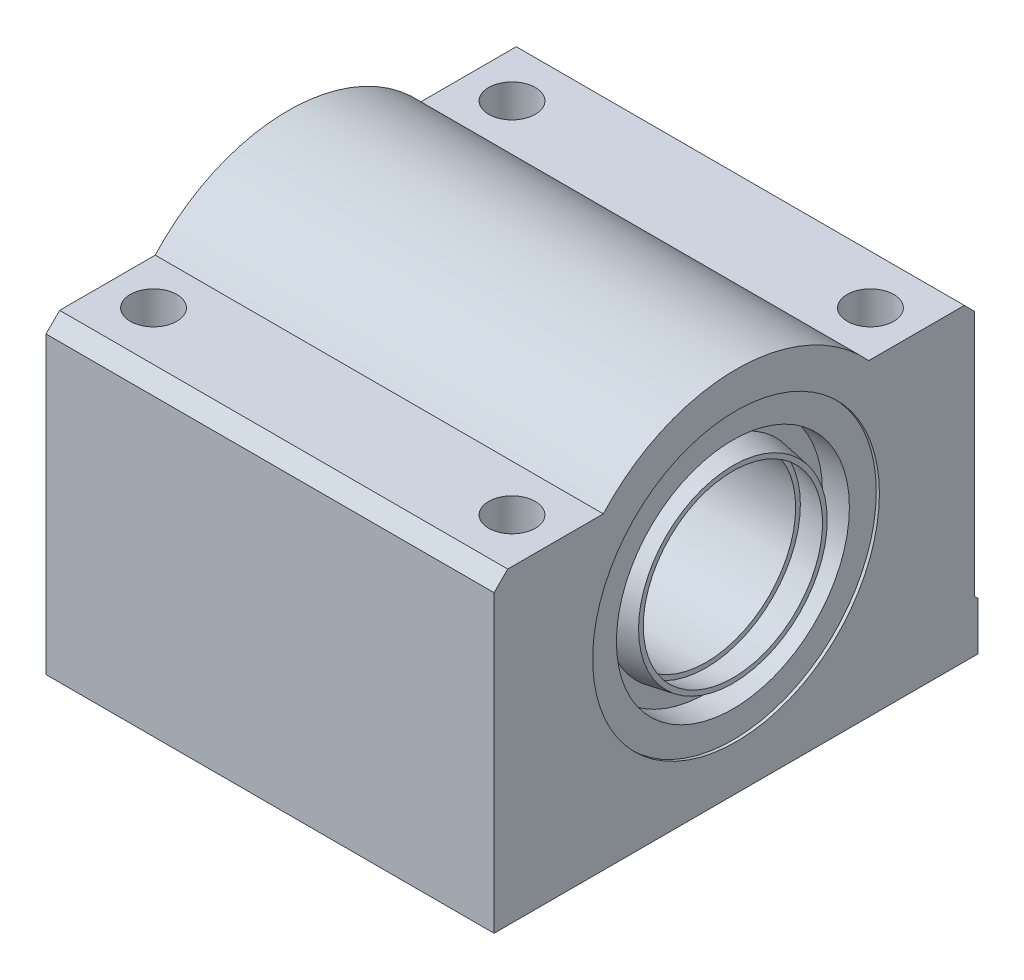
ISO-10303-21;
HEADER;
FILE_DESCRIPTION(('STEP AP214'),'2;1');
FILE_NAME('part.step','',(''),(''),'','','');
FILE_SCHEMA(('AUTOMOTIVE_DESIGN { 1 0 10303 214 1 1 1 1 }'));
ENDSEC;
DATA;
#1=APPLICATION_CONTEXT('core data for automotive mechanical design processes');
#2=APPLICATION_PROTOCOL_DEFINITION('international standard','automotive_design',2000,#1);
#3=PRODUCT_CONTEXT('',#1,'mechanical');
#4=PRODUCT('Part','Part','',(#3));
#5=PRODUCT_RELATED_PRODUCT_CATEGORY('part','',(#4));
#6=PRODUCT_DEFINITION_FORMATION('','',#4);
#7=PRODUCT_DEFINITION_CONTEXT('part definition',#1,'design');
#8=PRODUCT_DEFINITION('design','',#6,#7);
#9=PRODUCT_DEFINITION_SHAPE('','',#8);
#10=(LENGTH_UNIT() NAMED_UNIT(*) SI_UNIT(.MILLI.,.METRE.));
#11=(NAMED_UNIT(*) PLANE_ANGLE_UNIT() SI_UNIT($,.RADIAN.));
#12=(NAMED_UNIT(*) SI_UNIT($,.STERADIAN.) SOLID_ANGLE_UNIT());
#13=UNCERTAINTY_MEASURE_WITH_UNIT(LENGTH_MEASURE(1.E-05),#10,'distance_accuracy_value','');
#14=(GEOMETRIC_REPRESENTATION_CONTEXT(3) GLOBAL_UNCERTAINTY_ASSIGNED_CONTEXT((#13)) GLOBAL_UNIT_ASSIGNED_CONTEXT((#10,
#11,#12)) REPRESENTATION_CONTEXT('',''));
#15=CARTESIAN_POINT('',(0.,0.,0.));
#16=DIRECTION('',(0.,0.,1.));
#17=DIRECTION('',(1.,0.,0.));
#18=AXIS2_PLACEMENT_3D('',#15,#16,#17);
#19=CARTESIAN_POINT('',(-21.65,21.,0.));
#20=DIRECTION('',(-1.,0.,0.));
#21=DIRECTION('',(0.,0.,-1.));
#22=AXIS2_PLACEMENT_3D('',#19,#20,#21);
#23=PLANE('',#22);
#24=CARTESIAN_POINT('',(-21.65,21.,0.));
#25=DIRECTION('',(-1.,0.,0.));
#26=DIRECTION('',(0.,0.,1.));
#27=AXIS2_PLACEMENT_3D('',#24,#25,#26);
#28=CIRCLE('',#27,10.5289809421254);
#29=CARTESIAN_POINT('',(-21.65,21.,10.5289809421254));
#30=VERTEX_POINT('',#29);
#31=EDGE_CURVE('E139',#30,#30,#28,.T.);
#32=ORIENTED_EDGE('',*,*,#31,.T.);
#33=EDGE_LOOP('',(#32));
#34=FACE_BOUND('',#33,.T.);
#35=CARTESIAN_POINT('',(-21.65,21.,0.));
#36=DIRECTION('',(-1.,0.,0.));
#37=DIRECTION('',(0.,0.,1.));
#38=AXIS2_PLACEMENT_3D('',#35,#36,#37);
#39=CIRCLE('',#38,10.);
#40=CARTESIAN_POINT('',(-21.65,21.,10.));
#41=VERTEX_POINT('',#40);
#42=EDGE_CURVE('E161',#41,#41,#39,.T.);
#43=ORIENTED_EDGE('',*,*,#42,.F.);
#44=EDGE_LOOP('',(#43));
#45=FACE_BOUND('',#44,.T.);
#46=ADVANCED_FACE('F32',(#34,#45),#23,.T.);
#47=CARTESIAN_POINT('',(-21.65,21.,0.));
#48=DIRECTION('',(-1.,0.,0.));
#49=DIRECTION('',(0.,0.,1.));
#50=AXIS2_PLACEMENT_3D('',#47,#48,#49);
#51=CIRCLE('',#50,11.0579618842508);
#52=CARTESIAN_POINT('',(-21.65,21.,11.0579618842508));
#53=VERTEX_POINT('',#52);
#54=EDGE_CURVE('E143',#53,#53,#51,.T.);
#55=ORIENTED_EDGE('',*,*,#54,.F.);
#56=EDGE_LOOP('',(#55));
#57=FACE_BOUND('',#56,.T.);
#58=CARTESIAN_POINT('',(-21.65,21.,0.));
#59=DIRECTION('',(1.,0.,0.));
#60=DIRECTION('',(0.,0.,-1.));
#61=AXIS2_PLACEMENT_3D('',#58,#59,#60);
#62=CIRCLE('',#61,13.);
#63=CARTESIAN_POINT('',(-21.65,21.,-13.));
#64=VERTEX_POINT('',#63);
#65=EDGE_CURVE('E152',#64,#64,#62,.T.);
#66=ORIENTED_EDGE('',*,*,#65,.F.);
#67=EDGE_LOOP('',(#66));
#68=FACE_BOUND('',#67,.T.);
#69=ADVANCED_FACE('F270',(#57,#68),#23,.T.);
#70=CARTESIAN_POINT('',(25.,21.,0.));
#71=DIRECTION('',(-1.,0.,0.));
#72=DIRECTION('',(0.,0.,1.));
#73=AXIS2_PLACEMENT_3D('',#70,#71,#72);
#74=CYLINDRICAL_SURFACE('',#73,10.);
#75=CARTESIAN_POINT('',(21.65,21.,0.));
#76=DIRECTION('',(1.,0.,0.));
#77=DIRECTION('',(0.,0.,-1.));
#78=AXIS2_PLACEMENT_3D('',#75,#76,#77);
#79=CIRCLE('',#78,10.);
#80=CARTESIAN_POINT('',(21.65,21.,-10.));
#81=VERTEX_POINT('',#80);
#82=EDGE_CURVE('E183',#81,#81,#79,.T.);
#83=ORIENTED_EDGE('',*,*,#82,.T.);
#84=EDGE_LOOP('',(#83));
#85=FACE_BOUND('',#84,.T.);
#86=ORIENTED_EDGE('',*,*,#42,.T.);
#87=EDGE_LOOP('',(#86));
#88=FACE_BOUND('',#87,.T.);
#89=ADVANCED_FACE('F276',(#85,#88),#74,.F.);
#90=CARTESIAN_POINT('',(21.65,21.,0.));
#91=DIRECTION('',(1.,0.,0.));
#92=DIRECTION('',(0.,0.,-1.));
#93=AXIS2_PLACEMENT_3D('',#90,#91,#92);
#94=PLANE('',#93);
#95=CARTESIAN_POINT('',(21.65,21.,0.));
#96=DIRECTION('',(-1.,0.,0.));
#97=DIRECTION('',(0.,0.,1.));
#98=AXIS2_PLACEMENT_3D('',#95,#96,#97);
#99=CIRCLE('',#98,10.5289809421254);
#100=CARTESIAN_POINT('',(21.65,21.,10.5289809421254));
#101=VERTEX_POINT('',#100);
#102=EDGE_CURVE('E162',#101,#101,#99,.T.);
#103=ORIENTED_EDGE('',*,*,#102,.F.);
#104=EDGE_LOOP('',(#103));
#105=FACE_BOUND('',#104,.T.);
#106=ORIENTED_EDGE('',*,*,#82,.F.);
#107=EDGE_LOOP('',(#106));
#108=FACE_BOUND('',#107,.T.);
#109=ADVANCED_FACE('F311',(#105,#108),#94,.T.);
#110=CARTESIAN_POINT('',(21.65,21.,0.));
#111=DIRECTION('',(-1.,0.,0.));
#112=DIRECTION('',(0.,0.,1.));
#113=AXIS2_PLACEMENT_3D('',#110,#111,#112);
#114=CIRCLE('',#113,11.0579618842508);
#115=CARTESIAN_POINT('',(21.65,21.,11.0579618842508));
#116=VERTEX_POINT('',#115);
#117=EDGE_CURVE('E165',#116,#116,#114,.T.);
#118=ORIENTED_EDGE('',*,*,#117,.T.);
#119=EDGE_LOOP('',(#118));
#120=FACE_BOUND('',#119,.T.);
#121=CARTESIAN_POINT('',(21.65,21.,0.));
#122=DIRECTION('',(1.,0.,0.));
#123=DIRECTION('',(0.,0.,-1.));
#124=AXIS2_PLACEMENT_3D('',#121,#122,#123);
#125=CIRCLE('',#124,13.);
#126=CARTESIAN_POINT('',(21.65,21.,-13.));
#127=VERTEX_POINT('',#126);
#128=EDGE_CURVE('E223',#127,#127,#125,.F.);
#129=ORIENTED_EDGE('',*,*,#128,.F.);
#130=EDGE_LOOP('',(#129));
#131=FACE_BOUND('',#130,.T.);
#132=ADVANCED_FACE('F308',(#120,#131),#94,.T.);
#133=CARTESIAN_POINT('',(25.,21.,0.));
#134=DIRECTION('',(-1.,0.,0.));
#135=DIRECTION('',(0.,0.,1.));
#136=AXIS2_PLACEMENT_3D('',#133,#134,#135);
#137=PLANE('',#136);
#138=CARTESIAN_POINT('',(25.,21.,0.));
#139=DIRECTION('',(1.,0.,0.));
#140=DIRECTION('',(0.,0.,-1.));
#141=AXIS2_PLACEMENT_3D('',#138,#139,#140);
#142=CIRCLE('',#141,16.);
#143=CARTESIAN_POINT('',(25.,21.,-16.));
#144=VERTEX_POINT('',#143);
#145=EDGE_CURVE('E180',#144,#144,#142,.T.);
#146=ORIENTED_EDGE('',*,*,#145,.F.);
#147=EDGE_LOOP('',(#146));
#148=FACE_BOUND('',#147,.T.);
#149=DIRECTION('',(0.,-0.707106781186551,-0.707106781186544));
#150=VECTOR('',#149,1.);
#151=CARTESIAN_POINT('',(25.,5.75,-26.6190944663167));
#152=LINE('',#151,#150);
#153=CARTESIAN_POINT('',(25.,5.75,-26.6190944663167));
#154=VERTEX_POINT('',#153);
#155=CARTESIAN_POINT('',(25.,5.36909446631671,-27.));
#156=VERTEX_POINT('',#155);
#157=EDGE_CURVE('E129',#154,#156,#152,.T.);
#158=ORIENTED_EDGE('',*,*,#157,.F.);
#159=DIRECTION('',(0.,-1.,0.));
#160=VECTOR('',#159,1.);
#161=CARTESIAN_POINT('',(25.,5.75,-26.6190944663167));
#162=LINE('',#161,#160);
#163=CARTESIAN_POINT('',(25.,33.2972833989501,-26.6190944663167));
#164=VERTEX_POINT('',#163);
#165=EDGE_CURVE('E111',#164,#154,#162,.T.);
#166=ORIENTED_EDGE('',*,*,#165,.F.);
#167=DIRECTION('',(0.,-0.707106781186551,-0.707106781186544));
#168=VECTOR('',#167,1.);
#169=CARTESIAN_POINT('',(25.,34.44,-25.4763778652668));
#170=LINE('',#169,#168);
#171=CARTESIAN_POINT('',(25.,34.44,-25.4763778652668));
#172=VERTEX_POINT('',#171);
#173=EDGE_CURVE('E240',#164,#172,#170,.F.);
#174=ORIENTED_EDGE('',*,*,#173,.T.);
#175=DIRECTION('',(0.,0.,1.));
#176=VECTOR('',#175,1.);
#177=CARTESIAN_POINT('',(25.,34.44,-14.8110229221347));
#178=LINE('',#177,#176);
#179=CARTESIAN_POINT('',(25.,34.44,-14.8110229221347));
#180=VERTEX_POINT('',#179);
#181=EDGE_CURVE('E205',#172,#180,#178,.T.);
#182=ORIENTED_EDGE('',*,*,#181,.T.);
#183=CARTESIAN_POINT('',(25.,21.,0.));
#184=DIRECTION('',(1.,0.,0.));
#185=DIRECTION('',(0.,0.,1.));
#186=AXIS2_PLACEMENT_3D('',#183,#184,#185);
#187=CIRCLE('',#186,20.);
#188=CARTESIAN_POINT('',(25.,34.44,14.8110229221347));
#189=VERTEX_POINT('',#188);
#190=EDGE_CURVE('E207',#180,#189,#187,.T.);
#191=ORIENTED_EDGE('',*,*,#190,.T.);
#192=DIRECTION('',(0.,0.,1.));
#193=VECTOR('',#192,1.);
#194=CARTESIAN_POINT('',(25.,34.44,27.));
#195=LINE('',#194,#193);
#196=CARTESIAN_POINT('',(25.,34.44,25.4763778652668));
#197=VERTEX_POINT('',#196);
#198=EDGE_CURVE('E209',#189,#197,#195,.T.);
#199=ORIENTED_EDGE('',*,*,#198,.T.);
#200=DIRECTION('',(0.,0.707106781186546,-0.707106781186549));
#201=VECTOR('',#200,1.);
#202=CARTESIAN_POINT('',(25.,32.9163778652668,27.));
#203=LINE('',#202,#201);
#204=CARTESIAN_POINT('',(25.,32.9163778652668,27.));
#205=VERTEX_POINT('',#204);
#206=EDGE_CURVE('E55',#197,#205,#203,.F.);
#207=ORIENTED_EDGE('',*,*,#206,.T.);
#208=DIRECTION('',(0.,-1.,0.));
#209=VECTOR('',#208,1.);
#210=CARTESIAN_POINT('',(25.,34.44,27.));
#211=LINE('',#210,#209);
#212=CARTESIAN_POINT('',(25.,0.,27.));
#213=VERTEX_POINT('',#212);
#214=EDGE_CURVE('E211',#205,#213,#211,.T.);
#215=ORIENTED_EDGE('',*,*,#214,.T.);
#216=DIRECTION('',(0.,0.,-1.));
#217=VECTOR('',#216,1.);
#218=CARTESIAN_POINT('',(25.,0.,27.));
#219=LINE('',#218,#217);
#220=CARTESIAN_POINT('',(25.,0.,-27.));
#221=VERTEX_POINT('',#220);
#222=EDGE_CURVE('E199',#213,#221,#219,.T.);
#223=ORIENTED_EDGE('',*,*,#222,.T.);
#224=DIRECTION('',(0.,1.,0.));
#225=VECTOR('',#224,1.);
#226=CARTESIAN_POINT('',(25.,0.,-27.));
#227=LINE('',#226,#225);
#228=EDGE_CURVE('E202',#221,#156,#227,.T.);
#229=ORIENTED_EDGE('',*,*,#228,.T.);
#230=EDGE_LOOP('',(#158,#166,#174,#182,#191,#199,#207,#215,#223,#229));
#231=FACE_BOUND('',#230,.T.);
#232=ADVANCED_FACE('F254',(#148,#231),#137,.F.);
#233=CARTESIAN_POINT('',(25.,0.,27.));
#234=DIRECTION('',(0.,1.,0.));
#235=DIRECTION('',(0.,0.,1.));
#236=AXIS2_PLACEMENT_3D('',#233,#234,#235);
#237=PLANE('',#236);
#238=CARTESIAN_POINT('',(-20.,0.,-20.));
#239=DIRECTION('',(0.,-1.,0.));
#240=DIRECTION('',(0.,0.,-1.));
#241=AXIS2_PLACEMENT_3D('',#238,#239,#240);
#242=CIRCLE('',#241,2.6);
#243=CARTESIAN_POINT('',(-20.,0.,-22.6));
#244=VERTEX_POINT('',#243);
#245=EDGE_CURVE('E609',#244,#244,#242,.T.);
#246=ORIENTED_EDGE('',*,*,#245,.F.);
#247=EDGE_LOOP('',(#246));
#248=FACE_BOUND('',#247,.T.);
#249=CARTESIAN_POINT('',(20.,0.,-20.));
#250=DIRECTION('',(0.,-1.,0.));
#251=DIRECTION('',(0.,0.,-1.));
#252=AXIS2_PLACEMENT_3D('',#249,#250,#251);
#253=CIRCLE('',#252,2.6);
#254=CARTESIAN_POINT('',(20.,0.,-22.6));
#255=VERTEX_POINT('',#254);
#256=EDGE_CURVE('E627',#255,#255,#253,.T.);
#257=ORIENTED_EDGE('',*,*,#256,.F.);
#258=EDGE_LOOP('',(#257));
#259=FACE_BOUND('',#258,.T.);
#260=CARTESIAN_POINT('',(20.,0.,20.));
#261=DIRECTION('',(0.,-1.,0.));
#262=DIRECTION('',(0.,0.,-1.));
#263=AXIS2_PLACEMENT_3D('',#260,#261,#262);
#264=CIRCLE('',#263,2.6);
#265=CARTESIAN_POINT('',(20.,0.,17.4));
#266=VERTEX_POINT('',#265);
#267=EDGE_CURVE('E624',#266,#266,#264,.T.);
#268=ORIENTED_EDGE('',*,*,#267,.F.);
#269=EDGE_LOOP('',(#268));
#270=FACE_BOUND('',#269,.T.);
#271=CARTESIAN_POINT('',(-20.,0.,20.));
#272=DIRECTION('',(0.,-1.,0.));
#273=DIRECTION('',(0.,0.,-1.));
#274=AXIS2_PLACEMENT_3D('',#271,#272,#273);
#275=CIRCLE('',#274,2.6);
#276=CARTESIAN_POINT('',(-20.,0.,17.4));
#277=VERTEX_POINT('',#276);
#278=EDGE_CURVE('E133',#277,#277,#275,.T.);
#279=ORIENTED_EDGE('',*,*,#278,.F.);
#280=EDGE_LOOP('',(#279));
#281=FACE_BOUND('',#280,.T.);
#282=DIRECTION('',(-1.,0.,0.));
#283=VECTOR('',#282,1.);
#284=CARTESIAN_POINT('',(25.,0.,27.));
#285=LINE('',#284,#283);
#286=CARTESIAN_POINT('',(-25.,0.,27.));
#287=VERTEX_POINT('',#286);
#288=EDGE_CURVE('E213',#213,#287,#285,.T.);
#289=ORIENTED_EDGE('',*,*,#288,.T.);
#290=DIRECTION('',(0.,0.,-1.));
#291=VECTOR('',#290,1.);
#292=CARTESIAN_POINT('',(-25.,0.,27.));
#293=LINE('',#292,#291);
#294=CARTESIAN_POINT('',(-25.,0.,-27.));
#295=VERTEX_POINT('',#294);
#296=EDGE_CURVE('E184',#287,#295,#293,.T.);
#297=ORIENTED_EDGE('',*,*,#296,.T.);
#298=DIRECTION('',(-1.,0.,0.));
#299=VECTOR('',#298,1.);
#300=CARTESIAN_POINT('',(25.,0.,-27.));
#301=LINE('',#300,#299);
#302=EDGE_CURVE('E221',#221,#295,#301,.T.);
#303=ORIENTED_EDGE('',*,*,#302,.F.);
#304=ORIENTED_EDGE('',*,*,#222,.F.);
#305=EDGE_LOOP('',(#289,#297,#303,#304));
#306=FACE_BOUND('',#305,.T.);
#307=ADVANCED_FACE('F252',(#248,#259,#270,#281,#306),#237,.F.);
#308=CARTESIAN_POINT('',(25.,0.,-27.));
#309=DIRECTION('',(0.,0.,1.));
#310=DIRECTION('',(0.,-1.,0.));
#311=AXIS2_PLACEMENT_3D('',#308,#309,#310);
#312=PLANE('',#311);
#313=DIRECTION('',(0.,1.,0.));
#314=VECTOR('',#313,1.);
#315=CARTESIAN_POINT('',(-25.,0.,-27.));
#316=LINE('',#315,#314);
#317=CARTESIAN_POINT('',(-25.,5.36909446631671,-27.));
#318=VERTEX_POINT('',#317);
#319=EDGE_CURVE('E187',#295,#318,#316,.T.);
#320=ORIENTED_EDGE('',*,*,#319,.T.);
#321=DIRECTION('',(1.,0.,0.));
#322=VECTOR('',#321,1.);
#323=CARTESIAN_POINT('',(-25.,5.36909446631671,-27.));
#324=LINE('',#323,#322);
#325=EDGE_CURVE('E114',#318,#156,#324,.T.);
#326=ORIENTED_EDGE('',*,*,#325,.T.);
#327=ORIENTED_EDGE('',*,*,#228,.F.);
#328=ORIENTED_EDGE('',*,*,#302,.T.);
#329=EDGE_LOOP('',(#320,#326,#327,#328));
#330=FACE_BOUND('',#329,.T.);
#331=ADVANCED_FACE('F256',(#330),#312,.F.);
#332=CARTESIAN_POINT('',(25.,34.44,-14.8110229221347));
#333=DIRECTION('',(0.,-1.,0.));
#334=DIRECTION('',(0.,0.,-1.));
#335=AXIS2_PLACEMENT_3D('',#332,#333,#334);
#336=PLANE('',#335);
#337=CARTESIAN_POINT('',(-20.,34.44,-20.));
#338=DIRECTION('',(0.,-1.,0.));
#339=DIRECTION('',(0.,0.,-1.));
#340=AXIS2_PLACEMENT_3D('',#337,#338,#339);
#341=CIRCLE('',#340,2.6);
#342=CARTESIAN_POINT('',(-20.,34.44,-22.6));
#343=VERTEX_POINT('',#342);
#344=EDGE_CURVE('E612',#343,#343,#341,.T.);
#345=ORIENTED_EDGE('',*,*,#344,.T.);
#346=EDGE_LOOP('',(#345));
#347=FACE_BOUND('',#346,.T.);
#348=CARTESIAN_POINT('',(20.,34.44,-20.));
#349=DIRECTION('',(0.,-1.,0.));
#350=DIRECTION('',(0.,0.,-1.));
#351=AXIS2_PLACEMENT_3D('',#348,#349,#350);
#352=CIRCLE('',#351,2.6);
#353=CARTESIAN_POINT('',(20.,34.44,-22.6));
#354=VERTEX_POINT('',#353);
#355=EDGE_CURVE('E613',#354,#354,#352,.T.);
#356=ORIENTED_EDGE('',*,*,#355,.T.);
#357=EDGE_LOOP('',(#356));
#358=FACE_BOUND('',#357,.T.);
#359=ORIENTED_EDGE('',*,*,#181,.F.);
#360=DIRECTION('',(-1.,0.,0.));
#361=VECTOR('',#360,1.);
#362=CARTESIAN_POINT('',(25.,34.44,-25.4763778652668));
#363=LINE('',#362,#361);
#364=CARTESIAN_POINT('',(-25.,34.44,-25.4763778652668));
#365=VERTEX_POINT('',#364);
#366=EDGE_CURVE('E233',#172,#365,#363,.T.);
#367=ORIENTED_EDGE('',*,*,#366,.T.);
#368=DIRECTION('',(0.,0.,1.));
#369=VECTOR('',#368,1.);
#370=CARTESIAN_POINT('',(-25.,34.44,-14.8110229221347));
#371=LINE('',#370,#369);
#372=CARTESIAN_POINT('',(-25.,34.44,-14.8110229221347));
#373=VERTEX_POINT('',#372);
#374=EDGE_CURVE('E189',#365,#373,#371,.T.);
#375=ORIENTED_EDGE('',*,*,#374,.T.);
#376=DIRECTION('',(-1.,0.,0.));
#377=VECTOR('',#376,1.);
#378=CARTESIAN_POINT('',(25.,34.44,-14.8110229221347));
#379=LINE('',#378,#377);
#380=EDGE_CURVE('E218',#180,#373,#379,.T.);
#381=ORIENTED_EDGE('',*,*,#380,.F.);
#382=EDGE_LOOP('',(#359,#367,#375,#381));
#383=FACE_BOUND('',#382,.T.);
#384=ADVANCED_FACE('F258',(#347,#358,#383),#336,.F.);
#385=CARTESIAN_POINT('',(25.,21.,0.));
#386=DIRECTION('',(-1.,0.,0.));
#387=DIRECTION('',(0.,0.,1.));
#388=AXIS2_PLACEMENT_3D('',#385,#386,#387);
#389=CYLINDRICAL_SURFACE('',#388,20.);
#390=ORIENTED_EDGE('',*,*,#380,.T.);
#391=CARTESIAN_POINT('',(-25.,21.,0.));
#392=DIRECTION('',(1.,0.,0.));
#393=DIRECTION('',(0.,0.,1.));
#394=AXIS2_PLACEMENT_3D('',#391,#392,#393);
#395=CIRCLE('',#394,20.);
#396=CARTESIAN_POINT('',(-25.,34.44,14.8110229221347));
#397=VERTEX_POINT('',#396);
#398=EDGE_CURVE('E191',#373,#397,#395,.T.);
#399=ORIENTED_EDGE('',*,*,#398,.T.);
#400=DIRECTION('',(-1.,0.,0.));
#401=VECTOR('',#400,1.);
#402=CARTESIAN_POINT('',(25.,34.44,14.8110229221347));
#403=LINE('',#402,#401);
#404=EDGE_CURVE('E216',#189,#397,#403,.T.);
#405=ORIENTED_EDGE('',*,*,#404,.F.);
#406=ORIENTED_EDGE('',*,*,#190,.F.);
#407=EDGE_LOOP('',(#390,#399,#405,#406));
#408=FACE_BOUND('',#407,.T.);
#409=ADVANCED_FACE('F264',(#408),#389,.T.);
#410=CARTESIAN_POINT('',(25.,34.44,27.));
#411=DIRECTION('',(0.,-1.,0.));
#412=DIRECTION('',(0.,0.,-1.));
#413=AXIS2_PLACEMENT_3D('',#410,#411,#412);
#414=PLANE('',#413);
#415=CARTESIAN_POINT('',(20.,34.44,20.));
#416=DIRECTION('',(0.,-1.,0.));
#417=DIRECTION('',(0.,0.,-1.));
#418=AXIS2_PLACEMENT_3D('',#415,#416,#417);
#419=CIRCLE('',#418,2.6);
#420=CARTESIAN_POINT('',(20.,34.44,17.4));
#421=VERTEX_POINT('',#420);
#422=EDGE_CURVE('E616',#421,#421,#419,.T.);
#423=ORIENTED_EDGE('',*,*,#422,.T.);
#424=EDGE_LOOP('',(#423));
#425=FACE_BOUND('',#424,.T.);
#426=CARTESIAN_POINT('',(-20.,34.44,20.));
#427=DIRECTION('',(0.,-1.,0.));
#428=DIRECTION('',(0.,0.,-1.));
#429=AXIS2_PLACEMENT_3D('',#426,#427,#428);
#430=CIRCLE('',#429,2.6);
#431=CARTESIAN_POINT('',(-20.,34.44,17.4));
#432=VERTEX_POINT('',#431);
#433=EDGE_CURVE('E621',#432,#432,#430,.T.);
#434=ORIENTED_EDGE('',*,*,#433,.T.);
#435=EDGE_LOOP('',(#434));
#436=FACE_BOUND('',#435,.T.);
#437=DIRECTION('',(0.,0.,1.));
#438=VECTOR('',#437,1.);
#439=CARTESIAN_POINT('',(-25.,34.44,27.));
#440=LINE('',#439,#438);
#441=CARTESIAN_POINT('',(-25.,34.44,25.4763778652668));
#442=VERTEX_POINT('',#441);
#443=EDGE_CURVE('E194',#397,#442,#440,.T.);
#444=ORIENTED_EDGE('',*,*,#443,.T.);
#445=DIRECTION('',(1.,0.,0.));
#446=VECTOR('',#445,1.);
#447=CARTESIAN_POINT('',(25.,34.44,25.4763778652668));
#448=LINE('',#447,#446);
#449=EDGE_CURVE('E11',#442,#197,#448,.T.);
#450=ORIENTED_EDGE('',*,*,#449,.T.);
#451=ORIENTED_EDGE('',*,*,#198,.F.);
#452=ORIENTED_EDGE('',*,*,#404,.T.);
#453=EDGE_LOOP('',(#444,#450,#451,#452));
#454=FACE_BOUND('',#453,.T.);
#455=ADVANCED_FACE('F326',(#425,#436,#454),#414,.F.);
#456=CARTESIAN_POINT('',(25.,34.44,27.));
#457=DIRECTION('',(0.,0.,-1.));
#458=DIRECTION('',(-1.,0.,0.));
#459=AXIS2_PLACEMENT_3D('',#456,#457,#458);
#460=PLANE('',#459);
#461=ORIENTED_EDGE('',*,*,#214,.F.);
#462=DIRECTION('',(-1.,0.,0.));
#463=VECTOR('',#462,1.);
#464=CARTESIAN_POINT('',(25.,32.9163778652668,27.));
#465=LINE('',#464,#463);
#466=CARTESIAN_POINT('',(-25.,32.9163778652668,27.));
#467=VERTEX_POINT('',#466);
#468=EDGE_CURVE('E40',#205,#467,#465,.T.);
#469=ORIENTED_EDGE('',*,*,#468,.T.);
#470=DIRECTION('',(0.,-1.,0.));
#471=VECTOR('',#470,1.);
#472=CARTESIAN_POINT('',(-25.,34.44,27.));
#473=LINE('',#472,#471);
#474=EDGE_CURVE('E197',#467,#287,#473,.T.);
#475=ORIENTED_EDGE('',*,*,#474,.T.);
#476=ORIENTED_EDGE('',*,*,#288,.F.);
#477=EDGE_LOOP('',(#461,#469,#475,#476));
#478=FACE_BOUND('',#477,.T.);
#479=ADVANCED_FACE('F245',(#478),#460,.F.);
#480=CARTESIAN_POINT('',(-25.,21.,0.));
#481=DIRECTION('',(-1.,0.,0.));
#482=DIRECTION('',(0.,0.,1.));
#483=AXIS2_PLACEMENT_3D('',#480,#481,#482);
#484=PLANE('',#483);
#485=DIRECTION('',(0.,-1.,0.));
#486=VECTOR('',#485,1.);
#487=CARTESIAN_POINT('',(-25.,5.75,-26.6190944663167));
#488=LINE('',#487,#486);
#489=CARTESIAN_POINT('',(-25.,33.2972833989501,-26.6190944663167));
#490=VERTEX_POINT('',#489);
#491=CARTESIAN_POINT('',(-25.,5.75,-26.6190944663167));
#492=VERTEX_POINT('',#491);
#493=EDGE_CURVE('E47',#490,#492,#488,.T.);
#494=ORIENTED_EDGE('',*,*,#493,.T.);
#495=DIRECTION('',(0.,-0.707106781186551,-0.707106781186544));
#496=VECTOR('',#495,1.);
#497=CARTESIAN_POINT('',(-25.,5.75,-26.6190944663167));
#498=LINE('',#497,#496);
#499=EDGE_CURVE('E115',#492,#318,#498,.T.);
#500=ORIENTED_EDGE('',*,*,#499,.T.);
#501=ORIENTED_EDGE('',*,*,#319,.F.);
#502=ORIENTED_EDGE('',*,*,#296,.F.);
#503=ORIENTED_EDGE('',*,*,#474,.F.);
#504=DIRECTION('',(0.,-0.707106781186546,0.707106781186549));
#505=VECTOR('',#504,1.);
#506=CARTESIAN_POINT('',(-25.,40.4581889326334,19.4581889326334));
#507=LINE('',#506,#505);
#508=EDGE_CURVE('E236',#467,#442,#507,.F.);
#509=ORIENTED_EDGE('',*,*,#508,.T.);
#510=ORIENTED_EDGE('',*,*,#443,.F.);
#511=ORIENTED_EDGE('',*,*,#398,.F.);
#512=ORIENTED_EDGE('',*,*,#374,.F.);
#513=DIRECTION('',(0.,0.707106781186551,0.707106781186544));
#514=VECTOR('',#513,1.);
#515=CARTESIAN_POINT('',(-25.,40.4581889326333,-19.4581889326335));
#516=LINE('',#515,#514);
#517=EDGE_CURVE('E128',#365,#490,#516,.F.);
#518=ORIENTED_EDGE('',*,*,#517,.T.);
#519=EDGE_LOOP('',(#494,#500,#501,#502,#503,#509,#510,#511,#512,#518));
#520=FACE_BOUND('',#519,.T.);
#521=CARTESIAN_POINT('',(-25.,21.,0.));
#522=DIRECTION('',(1.,0.,0.));
#523=DIRECTION('',(0.,0.,-1.));
#524=AXIS2_PLACEMENT_3D('',#521,#522,#523);
#525=CIRCLE('',#524,16.);
#526=CARTESIAN_POINT('',(-25.,21.,-16.));
#527=VERTEX_POINT('',#526);
#528=EDGE_CURVE('E156',#527,#527,#525,.T.);
#529=ORIENTED_EDGE('',*,*,#528,.T.);
#530=EDGE_LOOP('',(#529));
#531=FACE_BOUND('',#530,.T.);
#532=ADVANCED_FACE('F125',(#520,#531),#484,.T.);
#533=CARTESIAN_POINT('',(21.65,21.,0.));
#534=DIRECTION('',(1.,0.,0.));
#535=DIRECTION('',(0.,0.,-1.));
#536=AXIS2_PLACEMENT_3D('',#533,#534,#535);
#537=CYLINDRICAL_SURFACE('',#536,16.);
#538=CARTESIAN_POINT('',(24.65,21.,0.));
#539=DIRECTION('',(1.,0.,0.));
#540=DIRECTION('',(0.,0.,-1.));
#541=AXIS2_PLACEMENT_3D('',#538,#539,#540);
#542=CIRCLE('',#541,16.);
#543=CARTESIAN_POINT('',(24.65,21.,-16.));
#544=VERTEX_POINT('',#543);
#545=EDGE_CURVE('E177',#544,#544,#542,.T.);
#546=ORIENTED_EDGE('',*,*,#545,.F.);
#547=EDGE_LOOP('',(#546));
#548=FACE_BOUND('',#547,.T.);
#549=ORIENTED_EDGE('',*,*,#145,.T.);
#550=EDGE_LOOP('',(#549));
#551=FACE_BOUND('',#550,.T.);
#552=ADVANCED_FACE('F306',(#548,#551),#537,.F.);
#553=CARTESIAN_POINT('',(24.65,21.,0.));
#554=DIRECTION('',(1.,0.,0.));
#555=DIRECTION('',(0.,0.,-1.));
#556=AXIS2_PLACEMENT_3D('',#553,#554,#555);
#557=PLANE('',#556);
#558=ORIENTED_EDGE('',*,*,#545,.T.);
#559=EDGE_LOOP('',(#558));
#560=FACE_BOUND('',#559,.T.);
#561=CARTESIAN_POINT('',(24.65,21.,0.));
#562=DIRECTION('',(1.,0.,0.));
#563=DIRECTION('',(0.,0.,-1.));
#564=AXIS2_PLACEMENT_3D('',#561,#562,#563);
#565=CIRCLE('',#564,13.);
#566=CARTESIAN_POINT('',(24.65,21.,-13.));
#567=VERTEX_POINT('',#566);
#568=EDGE_CURVE('E174',#567,#567,#565,.T.);
#569=ORIENTED_EDGE('',*,*,#568,.F.);
#570=EDGE_LOOP('',(#569));
#571=FACE_BOUND('',#570,.T.);
#572=ADVANCED_FACE('F302',(#560,#571),#557,.T.);
#573=CARTESIAN_POINT('',(24.65,21.,0.));
#574=DIRECTION('',(-1.,0.,0.));
#575=DIRECTION('',(0.,0.,1.));
#576=AXIS2_PLACEMENT_3D('',#573,#574,#575);
#577=CYLINDRICAL_SURFACE('',#576,13.);
#578=ORIENTED_EDGE('',*,*,#568,.T.);
#579=EDGE_LOOP('',(#578));
#580=FACE_BOUND('',#579,.T.);
#581=ORIENTED_EDGE('',*,*,#128,.T.);
#582=EDGE_LOOP('',(#581));
#583=FACE_BOUND('',#582,.T.);
#584=ADVANCED_FACE('F298',(#580,#583),#577,.F.);
#585=CARTESIAN_POINT('',(21.65,21.,0.));
#586=DIRECTION('',(-1.,0.,0.));
#587=DIRECTION('',(0.,0.,1.));
#588=AXIS2_PLACEMENT_3D('',#585,#586,#587);
#589=CONICAL_SURFACE('',#588,10.5289809421254,0.174532925199433);
#590=CARTESIAN_POINT('',(24.65,21.,0.));
#591=DIRECTION('',(-1.,0.,0.));
#592=DIRECTION('',(0.,0.,1.));
#593=AXIS2_PLACEMENT_3D('',#590,#591,#592);
#594=CIRCLE('',#593,10.);
#595=CARTESIAN_POINT('',(24.65,21.,10.));
#596=VERTEX_POINT('',#595);
#597=EDGE_CURVE('E171',#596,#596,#594,.T.);
#598=ORIENTED_EDGE('',*,*,#597,.F.);
#599=EDGE_LOOP('',(#598));
#600=FACE_BOUND('',#599,.T.);
#601=ORIENTED_EDGE('',*,*,#102,.T.);
#602=EDGE_LOOP('',(#601));
#603=FACE_BOUND('',#602,.T.);
#604=ADVANCED_FACE('F294',(#600,#603),#589,.F.);
#605=CARTESIAN_POINT('',(24.65,31.,0.));
#606=DIRECTION('',(-1.,0.,0.));
#607=DIRECTION('',(0.,0.,1.));
#608=AXIS2_PLACEMENT_3D('',#605,#606,#607);
#609=PLANE('',#608);
#610=CARTESIAN_POINT('',(24.65,21.,0.));
#611=DIRECTION('',(-1.,0.,0.));
#612=DIRECTION('',(0.,0.,1.));
#613=AXIS2_PLACEMENT_3D('',#610,#611,#612);
#614=CIRCLE('',#613,10.5289809421254);
#615=CARTESIAN_POINT('',(24.65,21.,10.5289809421254));
#616=VERTEX_POINT('',#615);
#617=EDGE_CURVE('E168',#616,#616,#614,.T.);
#618=ORIENTED_EDGE('',*,*,#617,.F.);
#619=EDGE_LOOP('',(#618));
#620=FACE_BOUND('',#619,.T.);
#621=ORIENTED_EDGE('',*,*,#597,.T.);
#622=EDGE_LOOP('',(#621));
#623=FACE_BOUND('',#622,.T.);
#624=ADVANCED_FACE('F290',(#620,#623),#609,.F.);
#625=CARTESIAN_POINT('',(24.65,21.,0.));
#626=DIRECTION('',(-1.,0.,0.));
#627=DIRECTION('',(0.,0.,1.));
#628=AXIS2_PLACEMENT_3D('',#625,#626,#627);
#629=CONICAL_SURFACE('',#628,10.5289809421254,0.174532925199433);
#630=ORIENTED_EDGE('',*,*,#117,.F.);
#631=EDGE_LOOP('',(#630));
#632=FACE_BOUND('',#631,.T.);
#633=ORIENTED_EDGE('',*,*,#617,.T.);
#634=EDGE_LOOP('',(#633));
#635=FACE_BOUND('',#634,.T.);
#636=ADVANCED_FACE('F286',(#632,#635),#629,.T.);
#637=CARTESIAN_POINT('',(-21.65,21.,0.));
#638=DIRECTION('',(-1.,0.,0.));
#639=DIRECTION('',(0.,0.,1.));
#640=AXIS2_PLACEMENT_3D('',#637,#638,#639);
#641=CYLINDRICAL_SURFACE('',#640,16.);
#642=CARTESIAN_POINT('',(-24.65,21.,0.));
#643=DIRECTION('',(-1.,0.,0.));
#644=DIRECTION('',(0.,0.,1.));
#645=AXIS2_PLACEMENT_3D('',#642,#643,#644);
#646=CIRCLE('',#645,16.);
#647=CARTESIAN_POINT('',(-24.65,21.,16.));
#648=VERTEX_POINT('',#647);
#649=EDGE_CURVE('E228',#648,#648,#646,.T.);
#650=ORIENTED_EDGE('',*,*,#649,.F.);
#651=EDGE_LOOP('',(#650));
#652=FACE_BOUND('',#651,.T.);
#653=ORIENTED_EDGE('',*,*,#528,.F.);
#654=EDGE_LOOP('',(#653));
#655=FACE_BOUND('',#654,.T.);
#656=ADVANCED_FACE('F283',(#652,#655),#641,.F.);
#657=CARTESIAN_POINT('',(-24.65,21.,0.));
#658=DIRECTION('',(-1.,0.,0.));
#659=DIRECTION('',(0.,0.,-1.));
#660=AXIS2_PLACEMENT_3D('',#657,#658,#659);
#661=PLANE('',#660);
#662=CARTESIAN_POINT('',(-24.65,21.,0.));
#663=DIRECTION('',(1.,0.,0.));
#664=DIRECTION('',(0.,0.,-1.));
#665=AXIS2_PLACEMENT_3D('',#662,#663,#664);
#666=CIRCLE('',#665,13.);
#667=CARTESIAN_POINT('',(-24.65,21.,-13.));
#668=VERTEX_POINT('',#667);
#669=EDGE_CURVE('E153',#668,#668,#666,.T.);
#670=ORIENTED_EDGE('',*,*,#669,.T.);
#671=EDGE_LOOP('',(#670));
#672=FACE_BOUND('',#671,.T.);
#673=ORIENTED_EDGE('',*,*,#649,.T.);
#674=EDGE_LOOP('',(#673));
#675=FACE_BOUND('',#674,.T.);
#676=ADVANCED_FACE('F281',(#672,#675),#661,.T.);
#677=CARTESIAN_POINT('',(-24.65,21.,0.));
#678=DIRECTION('',(1.,0.,0.));
#679=DIRECTION('',(0.,0.,-1.));
#680=AXIS2_PLACEMENT_3D('',#677,#678,#679);
#681=CYLINDRICAL_SURFACE('',#680,13.);
#682=ORIENTED_EDGE('',*,*,#669,.F.);
#683=EDGE_LOOP('',(#682));
#684=FACE_BOUND('',#683,.T.);
#685=ORIENTED_EDGE('',*,*,#65,.T.);
#686=EDGE_LOOP('',(#685));
#687=FACE_BOUND('',#686,.T.);
#688=ADVANCED_FACE('F370',(#684,#687),#681,.F.);
#689=CARTESIAN_POINT('',(-21.65,21.,0.));
#690=DIRECTION('',(1.,0.,0.));
#691=DIRECTION('',(0.,0.,1.));
#692=AXIS2_PLACEMENT_3D('',#689,#690,#691);
#693=CONICAL_SURFACE('',#692,10.5289809421254,0.174532925199433);
#694=CARTESIAN_POINT('',(-24.65,21.,0.));
#695=DIRECTION('',(-1.,0.,0.));
#696=DIRECTION('',(0.,0.,1.));
#697=AXIS2_PLACEMENT_3D('',#694,#695,#696);
#698=CIRCLE('',#697,10.);
#699=CARTESIAN_POINT('',(-24.65,21.,10.));
#700=VERTEX_POINT('',#699);
#701=EDGE_CURVE('E149',#700,#700,#698,.T.);
#702=ORIENTED_EDGE('',*,*,#701,.T.);
#703=EDGE_LOOP('',(#702));
#704=FACE_BOUND('',#703,.T.);
#705=ORIENTED_EDGE('',*,*,#31,.F.);
#706=EDGE_LOOP('',(#705));
#707=FACE_BOUND('',#706,.T.);
#708=ADVANCED_FACE('F363',(#704,#707),#693,.F.);
#709=CARTESIAN_POINT('',(-24.65,31.,0.));
#710=DIRECTION('',(1.,0.,0.));
#711=DIRECTION('',(0.,0.,1.));
#712=AXIS2_PLACEMENT_3D('',#709,#710,#711);
#713=PLANE('',#712);
#714=CARTESIAN_POINT('',(-24.65,21.,0.));
#715=DIRECTION('',(-1.,0.,0.));
#716=DIRECTION('',(0.,0.,1.));
#717=AXIS2_PLACEMENT_3D('',#714,#715,#716);
#718=CIRCLE('',#717,10.5289809421254);
#719=CARTESIAN_POINT('',(-24.65,21.,10.5289809421254));
#720=VERTEX_POINT('',#719);
#721=EDGE_CURVE('E146',#720,#720,#718,.T.);
#722=ORIENTED_EDGE('',*,*,#721,.T.);
#723=EDGE_LOOP('',(#722));
#724=FACE_BOUND('',#723,.T.);
#725=ORIENTED_EDGE('',*,*,#701,.F.);
#726=EDGE_LOOP('',(#725));
#727=FACE_BOUND('',#726,.T.);
#728=ADVANCED_FACE('F355',(#724,#727),#713,.F.);
#729=CARTESIAN_POINT('',(-24.65,21.,0.));
#730=DIRECTION('',(1.,0.,0.));
#731=DIRECTION('',(0.,0.,1.));
#732=AXIS2_PLACEMENT_3D('',#729,#730,#731);
#733=CONICAL_SURFACE('',#732,10.5289809421254,0.174532925199433);
#734=ORIENTED_EDGE('',*,*,#54,.T.);
#735=EDGE_LOOP('',(#734));
#736=FACE_BOUND('',#735,.T.);
#737=ORIENTED_EDGE('',*,*,#721,.F.);
#738=EDGE_LOOP('',(#737));
#739=FACE_BOUND('',#738,.T.);
#740=ADVANCED_FACE('F350',(#736,#739),#733,.T.);
#741=CARTESIAN_POINT('',(25.,34.44,-25.4763778652668));
#742=DIRECTION('',(0.,-0.707106781186544,0.707106781186551));
#743=DIRECTION('',(-1.,0.,0.));
#744=AXIS2_PLACEMENT_3D('',#741,#742,#743);
#745=PLANE('',#744);
#746=DIRECTION('',(1.,0.,0.));
#747=VECTOR('',#746,1.);
#748=CARTESIAN_POINT('',(-25.,33.2972833989501,-26.6190944663167));
#749=LINE('',#748,#747);
#750=EDGE_CURVE('E137',#490,#164,#749,.T.);
#751=ORIENTED_EDGE('',*,*,#750,.F.);
#752=ORIENTED_EDGE('',*,*,#517,.F.);
#753=ORIENTED_EDGE('',*,*,#366,.F.);
#754=ORIENTED_EDGE('',*,*,#173,.F.);
#755=EDGE_LOOP('',(#751,#752,#753,#754));
#756=FACE_BOUND('',#755,.T.);
#757=ADVANCED_FACE('F344',(#756),#745,.F.);
#758=CARTESIAN_POINT('',(25.,32.9163778652668,27.));
#759=DIRECTION('',(0.,-0.707106781186549,-0.707106781186546));
#760=DIRECTION('',(-1.,0.,0.));
#761=AXIS2_PLACEMENT_3D('',#758,#759,#760);
#762=PLANE('',#761);
#763=ORIENTED_EDGE('',*,*,#206,.F.);
#764=ORIENTED_EDGE('',*,*,#449,.F.);
#765=ORIENTED_EDGE('',*,*,#508,.F.);
#766=ORIENTED_EDGE('',*,*,#468,.F.);
#767=EDGE_LOOP('',(#763,#764,#765,#766));
#768=FACE_BOUND('',#767,.T.);
#769=ADVANCED_FACE('F34',(#768),#762,.F.);
#770=CARTESIAN_POINT('',(-25.,5.75,-26.6190944663167));
#771=DIRECTION('',(0.,0.,1.));
#772=DIRECTION('',(1.,0.,0.));
#773=AXIS2_PLACEMENT_3D('',#770,#771,#772);
#774=PLANE('',#773);
#775=ORIENTED_EDGE('',*,*,#165,.T.);
#776=DIRECTION('',(1.,0.,0.));
#777=VECTOR('',#776,1.);
#778=CARTESIAN_POINT('',(-25.,5.75,-26.6190944663167));
#779=LINE('',#778,#777);
#780=EDGE_CURVE('E107',#492,#154,#779,.T.);
#781=ORIENTED_EDGE('',*,*,#780,.F.);
#782=ORIENTED_EDGE('',*,*,#493,.F.);
#783=ORIENTED_EDGE('',*,*,#750,.T.);
#784=EDGE_LOOP('',(#775,#781,#782,#783));
#785=FACE_BOUND('',#784,.T.);
#786=ADVANCED_FACE('F109',(#785),#774,.F.);
#787=CARTESIAN_POINT('',(-25.,5.75,-26.6190944663167));
#788=DIRECTION('',(0.,-0.707106781186544,0.707106781186551));
#789=DIRECTION('',(0.,-0.707106781186551,-0.707106781186544));
#790=AXIS2_PLACEMENT_3D('',#787,#788,#789);
#791=PLANE('',#790);
#792=ORIENTED_EDGE('',*,*,#157,.T.);
#793=ORIENTED_EDGE('',*,*,#325,.F.);
#794=ORIENTED_EDGE('',*,*,#499,.F.);
#795=ORIENTED_EDGE('',*,*,#780,.T.);
#796=EDGE_LOOP('',(#792,#793,#794,#795));
#797=FACE_BOUND('',#796,.T.);
#798=ADVANCED_FACE('F118',(#797),#791,.F.);
#799=CARTESIAN_POINT('',(-20.,17.22,20.));
#800=DIRECTION('',(0.,-1.,0.));
#801=DIRECTION('',(0.,0.,-1.));
#802=AXIS2_PLACEMENT_3D('',#799,#800,#801);
#803=CYLINDRICAL_SURFACE('',#802,2.6);
#804=ORIENTED_EDGE('',*,*,#278,.T.);
#805=EDGE_LOOP('',(#804));
#806=FACE_BOUND('',#805,.T.);
#807=ORIENTED_EDGE('',*,*,#433,.F.);
#808=EDGE_LOOP('',(#807));
#809=FACE_BOUND('',#808,.T.);
#810=ADVANCED_FACE('F441',(#806,#809),#803,.F.);
#811=CARTESIAN_POINT('',(20.,17.22,20.));
#812=DIRECTION('',(0.,-1.,0.));
#813=DIRECTION('',(0.,0.,-1.));
#814=AXIS2_PLACEMENT_3D('',#811,#812,#813);
#815=CYLINDRICAL_SURFACE('',#814,2.6);
#816=ORIENTED_EDGE('',*,*,#267,.T.);
#817=EDGE_LOOP('',(#816));
#818=FACE_BOUND('',#817,.T.);
#819=ORIENTED_EDGE('',*,*,#422,.F.);
#820=EDGE_LOOP('',(#819));
#821=FACE_BOUND('',#820,.T.);
#822=ADVANCED_FACE('F446',(#818,#821),#815,.F.);
#823=CARTESIAN_POINT('',(20.,17.22,-20.));
#824=DIRECTION('',(0.,-1.,0.));
#825=DIRECTION('',(0.,0.,-1.));
#826=AXIS2_PLACEMENT_3D('',#823,#824,#825);
#827=CYLINDRICAL_SURFACE('',#826,2.6);
#828=ORIENTED_EDGE('',*,*,#256,.T.);
#829=EDGE_LOOP('',(#828));
#830=FACE_BOUND('',#829,.T.);
#831=ORIENTED_EDGE('',*,*,#355,.F.);
#832=EDGE_LOOP('',(#831));
#833=FACE_BOUND('',#832,.T.);
#834=ADVANCED_FACE('F459',(#830,#833),#827,.F.);
#835=CARTESIAN_POINT('',(-20.,17.22,-20.));
#836=DIRECTION('',(0.,-1.,0.));
#837=DIRECTION('',(0.,0.,-1.));
#838=AXIS2_PLACEMENT_3D('',#835,#836,#837);
#839=CYLINDRICAL_SURFACE('',#838,2.6);
#840=ORIENTED_EDGE('',*,*,#245,.T.);
#841=EDGE_LOOP('',(#840));
#842=FACE_BOUND('',#841,.T.);
#843=ORIENTED_EDGE('',*,*,#344,.F.);
#844=EDGE_LOOP('',(#843));
#845=FACE_BOUND('',#844,.T.);
#846=ADVANCED_FACE('F470',(#842,#845),#839,.F.);
#847=CLOSED_SHELL('',(#46,#69,#89,#109,#132,#232,#307,#331,#384,#409,#455,#479,#532,#552,#572,
#584,#604,#624,#636,#656,#676,#688,#708,#728,#740,#757,#769,#786,#798,#810,#822,#834,#846));
#848=MANIFOLD_SOLID_BREP('B2',#847);
#849=ADVANCED_BREP_SHAPE_REPRESENTATION('',(#18,#848),#14);
#850=SHAPE_DEFINITION_REPRESENTATION(#9,#849);
ENDSEC;
END-ISO-10303-21;
